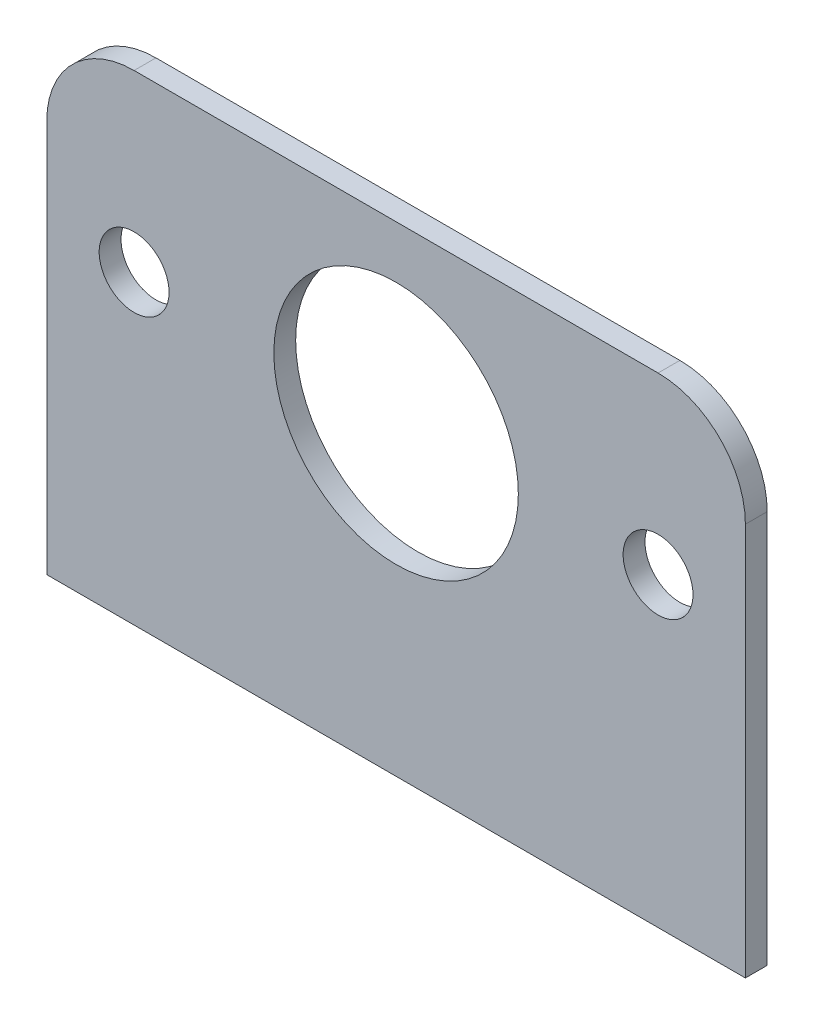
ISO-10303-21;
HEADER;
FILE_DESCRIPTION(('STEP AP214'),'2;1');
FILE_NAME('part.step','',(''),(''),'','','');
FILE_SCHEMA(('AUTOMOTIVE_DESIGN { 1 0 10303 214 1 1 1 1 }'));
ENDSEC;
DATA;
#1=APPLICATION_CONTEXT('core data for automotive mechanical design processes');
#2=APPLICATION_PROTOCOL_DEFINITION('international standard','automotive_design',2000,#1);
#3=PRODUCT_CONTEXT('',#1,'mechanical');
#4=PRODUCT('Part','Part','',(#3));
#5=PRODUCT_RELATED_PRODUCT_CATEGORY('part','',(#4));
#6=PRODUCT_DEFINITION_FORMATION('','',#4);
#7=PRODUCT_DEFINITION_CONTEXT('part definition',#1,'design');
#8=PRODUCT_DEFINITION('design','',#6,#7);
#9=PRODUCT_DEFINITION_SHAPE('','',#8);
#10=(LENGTH_UNIT() NAMED_UNIT(*) SI_UNIT(.MILLI.,.METRE.));
#11=(NAMED_UNIT(*) PLANE_ANGLE_UNIT() SI_UNIT($,.RADIAN.));
#12=(NAMED_UNIT(*) SI_UNIT($,.STERADIAN.) SOLID_ANGLE_UNIT());
#13=UNCERTAINTY_MEASURE_WITH_UNIT(LENGTH_MEASURE(1.E-05),#10,'distance_accuracy_value','');
#14=(GEOMETRIC_REPRESENTATION_CONTEXT(3) GLOBAL_UNCERTAINTY_ASSIGNED_CONTEXT((#13)) GLOBAL_UNIT_ASSIGNED_CONTEXT((#10,
#11,#12)) REPRESENTATION_CONTEXT('',''));
#15=CARTESIAN_POINT('',(0.,0.,0.));
#16=DIRECTION('',(0.,0.,1.));
#17=DIRECTION('',(1.,0.,0.));
#18=AXIS2_PLACEMENT_3D('',#15,#16,#17);
#19=CARTESIAN_POINT('',(0.,0.,1.5875));
#20=DIRECTION('',(0.,0.,1.));
#21=DIRECTION('',(1.,0.,0.));
#22=AXIS2_PLACEMENT_3D('',#19,#20,#21);
#23=PLANE('',#22);
#24=CARTESIAN_POINT('',(19.05,0.,1.5875));
#25=DIRECTION('',(0.,0.,1.));
#26=DIRECTION('',(1.,0.,0.));
#27=AXIS2_PLACEMENT_3D('',#24,#25,#26);
#28=CIRCLE('',#27,2.54);
#29=CARTESIAN_POINT('',(21.59,0.,1.5875));
#30=VERTEX_POINT('',#29);
#31=EDGE_CURVE('E130',#30,#30,#28,.T.);
#32=ORIENTED_EDGE('',*,*,#31,.F.);
#33=EDGE_LOOP('',(#32));
#34=FACE_BOUND('',#33,.T.);
#35=DIRECTION('',(-1.,0.,0.));
#36=VECTOR('',#35,1.);
#37=CARTESIAN_POINT('',(-25.4,12.7,1.5875));
#38=LINE('',#37,#36);
#39=CARTESIAN_POINT('',(19.05,12.7,1.5875));
#40=VERTEX_POINT('',#39);
#41=CARTESIAN_POINT('',(-19.05,12.7,1.5875));
#42=VERTEX_POINT('',#41);
#43=EDGE_CURVE('E103',#40,#42,#38,.T.);
#44=ORIENTED_EDGE('',*,*,#43,.T.);
#45=CARTESIAN_POINT('',(-19.05,6.35000000000001,1.5875));
#46=DIRECTION('',(0.,0.,1.));
#47=DIRECTION('',(1.,0.,0.));
#48=AXIS2_PLACEMENT_3D('',#45,#46,#47);
#49=CIRCLE('',#48,6.35);
#50=CARTESIAN_POINT('',(-25.4,6.35000000000001,1.5875));
#51=VERTEX_POINT('',#50);
#52=EDGE_CURVE('E47',#42,#51,#49,.T.);
#53=ORIENTED_EDGE('',*,*,#52,.T.);
#54=DIRECTION('',(0.,-1.,0.));
#55=VECTOR('',#54,1.);
#56=CARTESIAN_POINT('',(-25.4,12.7,1.5875));
#57=LINE('',#56,#55);
#58=CARTESIAN_POINT('',(-25.4,-22.225,1.58750000000001));
#59=VERTEX_POINT('',#58);
#60=EDGE_CURVE('E93',#51,#59,#57,.T.);
#61=ORIENTED_EDGE('',*,*,#60,.T.);
#62=DIRECTION('',(1.,0.,0.));
#63=VECTOR('',#62,1.);
#64=CARTESIAN_POINT('',(-25.4,-22.225,1.5875));
#65=LINE('',#64,#63);
#66=CARTESIAN_POINT('',(25.4,-22.225,1.58750000000001));
#67=VERTEX_POINT('',#66);
#68=EDGE_CURVE('E96',#59,#67,#65,.T.);
#69=ORIENTED_EDGE('',*,*,#68,.T.);
#70=DIRECTION('',(0.,1.,0.));
#71=VECTOR('',#70,1.);
#72=CARTESIAN_POINT('',(25.4,12.7,1.5875));
#73=LINE('',#72,#71);
#74=CARTESIAN_POINT('',(25.4,6.35000000000001,1.5875));
#75=VERTEX_POINT('',#74);
#76=EDGE_CURVE('E142',#67,#75,#73,.T.);
#77=ORIENTED_EDGE('',*,*,#76,.T.);
#78=CARTESIAN_POINT('',(19.05,6.35000000000001,1.5875));
#79=DIRECTION('',(0.,0.,1.));
#80=DIRECTION('',(1.,0.,0.));
#81=AXIS2_PLACEMENT_3D('',#78,#79,#80);
#82=CIRCLE('',#81,6.35);
#83=EDGE_CURVE('E158',#75,#40,#82,.T.);
#84=ORIENTED_EDGE('',*,*,#83,.T.);
#85=EDGE_LOOP('',(#44,#53,#61,#69,#77,#84));
#86=FACE_BOUND('',#85,.T.);
#87=CARTESIAN_POINT('',(0.,0.,1.5875));
#88=DIRECTION('',(0.,0.,1.));
#89=DIRECTION('',(1.,0.,0.));
#90=AXIS2_PLACEMENT_3D('',#87,#88,#89);
#91=CIRCLE('',#90,8.89);
#92=CARTESIAN_POINT('',(8.88999999999999,0.,1.5875));
#93=VERTEX_POINT('',#92);
#94=EDGE_CURVE('E136',#93,#93,#91,.T.);
#95=ORIENTED_EDGE('',*,*,#94,.F.);
#96=EDGE_LOOP('',(#95));
#97=FACE_BOUND('',#96,.T.);
#98=CARTESIAN_POINT('',(-19.05,0.,1.5875));
#99=DIRECTION('',(0.,0.,1.));
#100=DIRECTION('',(1.,0.,0.));
#101=AXIS2_PLACEMENT_3D('',#98,#99,#100);
#102=CIRCLE('',#101,2.54);
#103=CARTESIAN_POINT('',(-16.51,0.,1.5875));
#104=VERTEX_POINT('',#103);
#105=EDGE_CURVE('E124',#104,#104,#102,.T.);
#106=ORIENTED_EDGE('',*,*,#105,.F.);
#107=EDGE_LOOP('',(#106));
#108=FACE_BOUND('',#107,.T.);
#109=ADVANCED_FACE('F39',(#34,#86,#97,#108),#23,.T.);
#110=CARTESIAN_POINT('',(0.,0.,0.));
#111=DIRECTION('',(0.,0.,1.));
#112=DIRECTION('',(1.,0.,0.));
#113=AXIS2_PLACEMENT_3D('',#110,#111,#112);
#114=PLANE('',#113);
#115=DIRECTION('',(0.,-1.,0.));
#116=VECTOR('',#115,1.);
#117=CARTESIAN_POINT('',(-25.4,12.7,0.));
#118=LINE('',#117,#116);
#119=CARTESIAN_POINT('',(-25.4,6.35000000000001,0.));
#120=VERTEX_POINT('',#119);
#121=CARTESIAN_POINT('',(-25.4,-22.225,0.));
#122=VERTEX_POINT('',#121);
#123=EDGE_CURVE('E118',#120,#122,#118,.T.);
#124=ORIENTED_EDGE('',*,*,#123,.F.);
#125=CARTESIAN_POINT('',(-19.05,6.35000000000001,0.));
#126=DIRECTION('',(0.,0.,1.));
#127=DIRECTION('',(1.,0.,0.));
#128=AXIS2_PLACEMENT_3D('',#125,#126,#127);
#129=CIRCLE('',#128,6.35);
#130=CARTESIAN_POINT('',(-19.05,12.7,0.));
#131=VERTEX_POINT('',#130);
#132=EDGE_CURVE('E152',#120,#131,#129,.F.);
#133=ORIENTED_EDGE('',*,*,#132,.T.);
#134=DIRECTION('',(-1.,0.,0.));
#135=VECTOR('',#134,1.);
#136=CARTESIAN_POINT('',(-25.4,12.7,0.));
#137=LINE('',#136,#135);
#138=CARTESIAN_POINT('',(19.05,12.7,0.));
#139=VERTEX_POINT('',#138);
#140=EDGE_CURVE('E146',#139,#131,#137,.T.);
#141=ORIENTED_EDGE('',*,*,#140,.F.);
#142=CARTESIAN_POINT('',(19.05,6.35000000000001,0.));
#143=DIRECTION('',(0.,0.,1.));
#144=DIRECTION('',(1.,0.,0.));
#145=AXIS2_PLACEMENT_3D('',#142,#143,#144);
#146=CIRCLE('',#145,6.35);
#147=CARTESIAN_POINT('',(25.4,6.35000000000001,0.));
#148=VERTEX_POINT('',#147);
#149=EDGE_CURVE('E150',#139,#148,#146,.F.);
#150=ORIENTED_EDGE('',*,*,#149,.T.);
#151=DIRECTION('',(0.,1.,0.));
#152=VECTOR('',#151,1.);
#153=CARTESIAN_POINT('',(25.4,12.7,0.));
#154=LINE('',#153,#152);
#155=CARTESIAN_POINT('',(25.4,-22.225,0.));
#156=VERTEX_POINT('',#155);
#157=EDGE_CURVE('E139',#156,#148,#154,.T.);
#158=ORIENTED_EDGE('',*,*,#157,.F.);
#159=DIRECTION('',(1.,0.,0.));
#160=VECTOR('',#159,1.);
#161=CARTESIAN_POINT('',(-25.4,-22.225,0.));
#162=LINE('',#161,#160);
#163=EDGE_CURVE('E119',#122,#156,#162,.T.);
#164=ORIENTED_EDGE('',*,*,#163,.F.);
#165=EDGE_LOOP('',(#124,#133,#141,#150,#158,#164));
#166=FACE_BOUND('',#165,.T.);
#167=CARTESIAN_POINT('',(0.,0.,0.));
#168=DIRECTION('',(0.,0.,1.));
#169=DIRECTION('',(1.,0.,0.));
#170=AXIS2_PLACEMENT_3D('',#167,#168,#169);
#171=CIRCLE('',#170,8.89);
#172=CARTESIAN_POINT('',(8.88999999999999,0.,0.));
#173=VERTEX_POINT('',#172);
#174=EDGE_CURVE('E133',#173,#173,#171,.T.);
#175=ORIENTED_EDGE('',*,*,#174,.T.);
#176=EDGE_LOOP('',(#175));
#177=FACE_BOUND('',#176,.T.);
#178=CARTESIAN_POINT('',(19.05,0.,0.));
#179=DIRECTION('',(0.,0.,1.));
#180=DIRECTION('',(1.,0.,0.));
#181=AXIS2_PLACEMENT_3D('',#178,#179,#180);
#182=CIRCLE('',#181,2.54);
#183=CARTESIAN_POINT('',(21.59,0.,0.));
#184=VERTEX_POINT('',#183);
#185=EDGE_CURVE('E127',#184,#184,#182,.T.);
#186=ORIENTED_EDGE('',*,*,#185,.T.);
#187=EDGE_LOOP('',(#186));
#188=FACE_BOUND('',#187,.T.);
#189=CARTESIAN_POINT('',(-19.05,0.,0.));
#190=DIRECTION('',(0.,0.,1.));
#191=DIRECTION('',(1.,0.,0.));
#192=AXIS2_PLACEMENT_3D('',#189,#190,#191);
#193=CIRCLE('',#192,2.54);
#194=CARTESIAN_POINT('',(-16.51,0.,0.));
#195=VERTEX_POINT('',#194);
#196=EDGE_CURVE('E114',#195,#195,#193,.T.);
#197=ORIENTED_EDGE('',*,*,#196,.T.);
#198=EDGE_LOOP('',(#197));
#199=FACE_BOUND('',#198,.T.);
#200=ADVANCED_FACE('F165',(#166,#177,#188,#199),#114,.F.);
#201=CARTESIAN_POINT('',(25.4,12.7,1.5875));
#202=DIRECTION('',(-1.,0.,0.));
#203=DIRECTION('',(0.,-1.,0.));
#204=AXIS2_PLACEMENT_3D('',#201,#202,#203);
#205=PLANE('',#204);
#206=ORIENTED_EDGE('',*,*,#157,.T.);
#207=DIRECTION('',(0.,0.,-1.));
#208=VECTOR('',#207,1.);
#209=CARTESIAN_POINT('',(25.4,6.35000000000001,1.5875));
#210=LINE('',#209,#208);
#211=EDGE_CURVE('E11',#148,#75,#210,.F.);
#212=ORIENTED_EDGE('',*,*,#211,.T.);
#213=ORIENTED_EDGE('',*,*,#76,.F.);
#214=DIRECTION('',(0.,0.,-1.));
#215=VECTOR('',#214,1.);
#216=CARTESIAN_POINT('',(25.4,-22.225,53.2727553926166));
#217=LINE('',#216,#215);
#218=EDGE_CURVE('E113',#67,#156,#217,.T.);
#219=ORIENTED_EDGE('',*,*,#218,.T.);
#220=EDGE_LOOP('',(#206,#212,#213,#219));
#221=FACE_BOUND('',#220,.T.);
#222=ADVANCED_FACE('F167',(#221),#205,.F.);
#223=CARTESIAN_POINT('',(-25.4,12.7,1.5875));
#224=DIRECTION('',(0.,-1.,0.));
#225=DIRECTION('',(0.,0.,-1.));
#226=AXIS2_PLACEMENT_3D('',#223,#224,#225);
#227=PLANE('',#226);
#228=ORIENTED_EDGE('',*,*,#140,.T.);
#229=DIRECTION('',(0.,0.,-1.));
#230=VECTOR('',#229,1.);
#231=CARTESIAN_POINT('',(-19.05,12.7,1.5875));
#232=LINE('',#231,#230);
#233=EDGE_CURVE('E60',#131,#42,#232,.F.);
#234=ORIENTED_EDGE('',*,*,#233,.T.);
#235=ORIENTED_EDGE('',*,*,#43,.F.);
#236=DIRECTION('',(0.,0.,-1.));
#237=VECTOR('',#236,1.);
#238=CARTESIAN_POINT('',(19.05,12.7,1.5875));
#239=LINE('',#238,#237);
#240=EDGE_CURVE('E154',#40,#139,#239,.T.);
#241=ORIENTED_EDGE('',*,*,#240,.T.);
#242=EDGE_LOOP('',(#228,#234,#235,#241));
#243=FACE_BOUND('',#242,.T.);
#244=ADVANCED_FACE('F162',(#243),#227,.F.);
#245=CARTESIAN_POINT('',(-25.4,12.7,1.5875));
#246=DIRECTION('',(1.,0.,0.));
#247=DIRECTION('',(0.,1.,0.));
#248=AXIS2_PLACEMENT_3D('',#245,#246,#247);
#249=PLANE('',#248);
#250=ORIENTED_EDGE('',*,*,#60,.F.);
#251=DIRECTION('',(0.,0.,-1.));
#252=VECTOR('',#251,1.);
#253=CARTESIAN_POINT('',(-25.4,6.35000000000001,1.5875));
#254=LINE('',#253,#252);
#255=EDGE_CURVE('E102',#51,#120,#254,.T.);
#256=ORIENTED_EDGE('',*,*,#255,.T.);
#257=ORIENTED_EDGE('',*,*,#123,.T.);
#258=DIRECTION('',(0.,0.,-1.));
#259=VECTOR('',#258,1.);
#260=CARTESIAN_POINT('',(-25.4,-22.225,53.2727553926166));
#261=LINE('',#260,#259);
#262=EDGE_CURVE('E110',#59,#122,#261,.T.);
#263=ORIENTED_EDGE('',*,*,#262,.F.);
#264=EDGE_LOOP('',(#250,#256,#257,#263));
#265=FACE_BOUND('',#264,.T.);
#266=ADVANCED_FACE('F116',(#265),#249,.F.);
#267=CARTESIAN_POINT('',(0.,0.,1.5875));
#268=DIRECTION('',(0.,0.,-1.));
#269=DIRECTION('',(-1.,0.,0.));
#270=AXIS2_PLACEMENT_3D('',#267,#268,#269);
#271=CYLINDRICAL_SURFACE('',#270,8.89);
#272=ORIENTED_EDGE('',*,*,#94,.T.);
#273=EDGE_LOOP('',(#272));
#274=FACE_BOUND('',#273,.T.);
#275=ORIENTED_EDGE('',*,*,#174,.F.);
#276=EDGE_LOOP('',(#275));
#277=FACE_BOUND('',#276,.T.);
#278=ADVANCED_FACE('F188',(#274,#277),#271,.F.);
#279=CARTESIAN_POINT('',(19.05,0.,1.5875));
#280=DIRECTION('',(0.,0.,-1.));
#281=DIRECTION('',(-1.,0.,0.));
#282=AXIS2_PLACEMENT_3D('',#279,#280,#281);
#283=CYLINDRICAL_SURFACE('',#282,2.54);
#284=ORIENTED_EDGE('',*,*,#31,.T.);
#285=EDGE_LOOP('',(#284));
#286=FACE_BOUND('',#285,.T.);
#287=ORIENTED_EDGE('',*,*,#185,.F.);
#288=EDGE_LOOP('',(#287));
#289=FACE_BOUND('',#288,.T.);
#290=ADVANCED_FACE('F236',(#286,#289),#283,.F.);
#291=CARTESIAN_POINT('',(-19.05,0.,1.5875));
#292=DIRECTION('',(0.,0.,-1.));
#293=DIRECTION('',(-1.,0.,0.));
#294=AXIS2_PLACEMENT_3D('',#291,#292,#293);
#295=CYLINDRICAL_SURFACE('',#294,2.54);
#296=ORIENTED_EDGE('',*,*,#105,.T.);
#297=EDGE_LOOP('',(#296));
#298=FACE_BOUND('',#297,.T.);
#299=ORIENTED_EDGE('',*,*,#196,.F.);
#300=EDGE_LOOP('',(#299));
#301=FACE_BOUND('',#300,.T.);
#302=ADVANCED_FACE('F176',(#298,#301),#295,.F.);
#303=CARTESIAN_POINT('',(-25.4,-22.225,53.2727553926166));
#304=DIRECTION('',(0.,1.,0.));
#305=DIRECTION('',(0.,0.,1.));
#306=AXIS2_PLACEMENT_3D('',#303,#304,#305);
#307=PLANE('',#306);
#308=ORIENTED_EDGE('',*,*,#68,.F.);
#309=ORIENTED_EDGE('',*,*,#262,.T.);
#310=ORIENTED_EDGE('',*,*,#163,.T.);
#311=ORIENTED_EDGE('',*,*,#218,.F.);
#312=EDGE_LOOP('',(#308,#309,#310,#311));
#313=FACE_BOUND('',#312,.T.);
#314=ADVANCED_FACE('F108',(#313),#307,.F.);
#315=CARTESIAN_POINT('',(-19.05,6.35000000000001,1.5875));
#316=DIRECTION('',(0.,0.,-1.));
#317=DIRECTION('',(-1.,0.,0.));
#318=AXIS2_PLACEMENT_3D('',#315,#316,#317);
#319=CYLINDRICAL_SURFACE('',#318,6.35);
#320=ORIENTED_EDGE('',*,*,#52,.F.);
#321=ORIENTED_EDGE('',*,*,#233,.F.);
#322=ORIENTED_EDGE('',*,*,#132,.F.);
#323=ORIENTED_EDGE('',*,*,#255,.F.);
#324=EDGE_LOOP('',(#320,#321,#322,#323));
#325=FACE_BOUND('',#324,.T.);
#326=ADVANCED_FACE('F169',(#325),#319,.T.);
#327=CARTESIAN_POINT('',(19.05,6.35000000000001,1.5875));
#328=DIRECTION('',(0.,0.,-1.));
#329=DIRECTION('',(-1.,0.,0.));
#330=AXIS2_PLACEMENT_3D('',#327,#328,#329);
#331=CYLINDRICAL_SURFACE('',#330,6.35);
#332=ORIENTED_EDGE('',*,*,#83,.F.);
#333=ORIENTED_EDGE('',*,*,#211,.F.);
#334=ORIENTED_EDGE('',*,*,#149,.F.);
#335=ORIENTED_EDGE('',*,*,#240,.F.);
#336=EDGE_LOOP('',(#332,#333,#334,#335));
#337=FACE_BOUND('',#336,.T.);
#338=ADVANCED_FACE('F41',(#337),#331,.T.);
#339=CLOSED_SHELL('',(#109,#200,#222,#244,#266,#278,#290,#302,#314,#326,#338));
#340=MANIFOLD_SOLID_BREP('B2',#339);
#341=ADVANCED_BREP_SHAPE_REPRESENTATION('',(#18,#340),#14);
#342=SHAPE_DEFINITION_REPRESENTATION(#9,#341);
ENDSEC;
END-ISO-10303-21;
